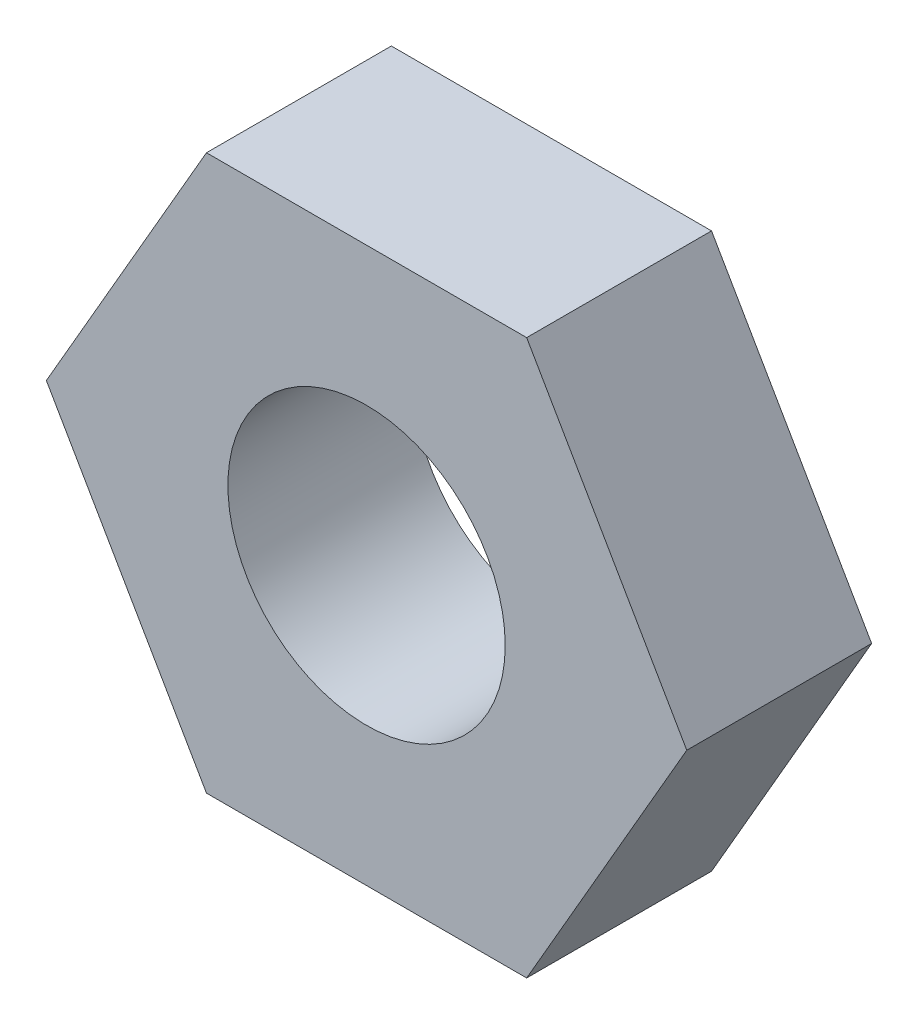
ISO-10303-21;
HEADER;
FILE_DESCRIPTION(('STEP AP214'),'2;1');
FILE_NAME('part.step','',(''),(''),'','','');
FILE_SCHEMA(('AUTOMOTIVE_DESIGN { 1 0 10303 214 1 1 1 1 }'));
ENDSEC;
DATA;
#1=APPLICATION_CONTEXT('core data for automotive mechanical design processes');
#2=APPLICATION_PROTOCOL_DEFINITION('international standard','automotive_design',2000,#1);
#3=PRODUCT_CONTEXT('',#1,'mechanical');
#4=PRODUCT('Part','Part','',(#3));
#5=PRODUCT_RELATED_PRODUCT_CATEGORY('part','',(#4));
#6=PRODUCT_DEFINITION_FORMATION('','',#4);
#7=PRODUCT_DEFINITION_CONTEXT('part definition',#1,'design');
#8=PRODUCT_DEFINITION('design','',#6,#7);
#9=PRODUCT_DEFINITION_SHAPE('','',#8);
#10=(LENGTH_UNIT() NAMED_UNIT(*) SI_UNIT(.MILLI.,.METRE.));
#11=(NAMED_UNIT(*) PLANE_ANGLE_UNIT() SI_UNIT($,.RADIAN.));
#12=(NAMED_UNIT(*) SI_UNIT($,.STERADIAN.) SOLID_ANGLE_UNIT());
#13=UNCERTAINTY_MEASURE_WITH_UNIT(LENGTH_MEASURE(1.E-05),#10,'distance_accuracy_value','');
#14=(GEOMETRIC_REPRESENTATION_CONTEXT(3) GLOBAL_UNCERTAINTY_ASSIGNED_CONTEXT((#13)) GLOBAL_UNIT_ASSIGNED_CONTEXT((#10,
#11,#12)) REPRESENTATION_CONTEXT('',''));
#15=CARTESIAN_POINT('',(0.,0.,0.));
#16=DIRECTION('',(0.,0.,1.));
#17=DIRECTION('',(1.,0.,0.));
#18=AXIS2_PLACEMENT_3D('',#15,#16,#17);
#19=CARTESIAN_POINT('',(0.,0.,2.));
#20=DIRECTION('',(0.,0.,1.));
#21=DIRECTION('',(1.,0.,0.));
#22=AXIS2_PLACEMENT_3D('',#19,#20,#21);
#23=PLANE('',#22);
#24=DIRECTION('',(0.499999999999995,0.866025403784441,0.));
#25=VECTOR('',#24,1.);
#26=CARTESIAN_POINT('',(1.73205080756891,-2.99999999999998,2.));
#27=LINE('',#26,#25);
#28=CARTESIAN_POINT('',(1.73205080756891,-2.99999999999998,2.));
#29=VERTEX_POINT('',#28);
#30=CARTESIAN_POINT('',(3.46410161513776,0.,2.));
#31=VERTEX_POINT('',#30);
#32=EDGE_CURVE('E152',#29,#31,#27,.T.);
#33=ORIENTED_EDGE('',*,*,#32,.T.);
#34=DIRECTION('',(-0.500000000000001,0.866025403784438,0.));
#35=VECTOR('',#34,1.);
#36=CARTESIAN_POINT('',(3.46410161513776,0.,2.));
#37=LINE('',#36,#35);
#38=CARTESIAN_POINT('',(1.73205080756887,3.00000000000001,2.));
#39=VERTEX_POINT('',#38);
#40=EDGE_CURVE('E100',#31,#39,#37,.T.);
#41=ORIENTED_EDGE('',*,*,#40,.T.);
#42=DIRECTION('',(-1.,0.,0.));
#43=VECTOR('',#42,1.);
#44=CARTESIAN_POINT('',(1.73205080756887,3.00000000000001,2.));
#45=LINE('',#44,#43);
#46=CARTESIAN_POINT('',(-1.73205080756889,2.99999999999999,2.));
#47=VERTEX_POINT('',#46);
#48=EDGE_CURVE('E113',#39,#47,#45,.T.);
#49=ORIENTED_EDGE('',*,*,#48,.T.);
#50=DIRECTION('',(-0.499999999999995,-0.866025403784442,0.));
#51=VECTOR('',#50,1.);
#52=CARTESIAN_POINT('',(-1.73205080756889,2.99999999999999,2.));
#53=LINE('',#52,#51);
#54=CARTESIAN_POINT('',(-3.46410161513776,0.,2.));
#55=VERTEX_POINT('',#54);
#56=EDGE_CURVE('E107',#47,#55,#53,.T.);
#57=ORIENTED_EDGE('',*,*,#56,.T.);
#58=DIRECTION('',(0.500000000000007,-0.866025403784435,0.));
#59=VECTOR('',#58,1.);
#60=CARTESIAN_POINT('',(-3.46410161513776,0.,2.));
#61=LINE('',#60,#59);
#62=CARTESIAN_POINT('',(-1.73205080756885,-3.00000000000002,2.));
#63=VERTEX_POINT('',#62);
#64=EDGE_CURVE('E111',#55,#63,#61,.T.);
#65=ORIENTED_EDGE('',*,*,#64,.T.);
#66=DIRECTION('',(1.,0.,0.));
#67=VECTOR('',#66,1.);
#68=CARTESIAN_POINT('',(-1.73205080756885,-3.00000000000002,2.));
#69=LINE('',#68,#67);
#70=EDGE_CURVE('E63',#63,#29,#69,.T.);
#71=ORIENTED_EDGE('',*,*,#70,.T.);
#72=EDGE_LOOP('',(#33,#41,#49,#57,#65,#71));
#73=FACE_BOUND('',#72,.T.);
#74=CARTESIAN_POINT('',(0.,0.,2.));
#75=DIRECTION('',(0.,0.,1.));
#76=DIRECTION('',(1.,0.,0.));
#77=AXIS2_PLACEMENT_3D('',#74,#75,#76);
#78=CIRCLE('',#77,1.5);
#79=CARTESIAN_POINT('',(1.5,0.,2.));
#80=VERTEX_POINT('',#79);
#81=EDGE_CURVE('E140',#80,#80,#78,.T.);
#82=ORIENTED_EDGE('',*,*,#81,.F.);
#83=EDGE_LOOP('',(#82));
#84=FACE_BOUND('',#83,.T.);
#85=ADVANCED_FACE('F45',(#73,#84),#23,.T.);
#86=CARTESIAN_POINT('',(0.,0.,0.));
#87=DIRECTION('',(0.,0.,1.));
#88=DIRECTION('',(1.,0.,0.));
#89=AXIS2_PLACEMENT_3D('',#86,#87,#88);
#90=PLANE('',#89);
#91=DIRECTION('',(0.499999999999995,0.866025403784441,0.));
#92=VECTOR('',#91,1.);
#93=CARTESIAN_POINT('',(1.73205080756891,-2.99999999999998,0.));
#94=LINE('',#93,#92);
#95=CARTESIAN_POINT('',(1.73205080756891,-2.99999999999998,0.));
#96=VERTEX_POINT('',#95);
#97=CARTESIAN_POINT('',(3.46410161513776,0.,0.));
#98=VERTEX_POINT('',#97);
#99=EDGE_CURVE('E135',#96,#98,#94,.T.);
#100=ORIENTED_EDGE('',*,*,#99,.F.);
#101=DIRECTION('',(1.,0.,0.));
#102=VECTOR('',#101,1.);
#103=CARTESIAN_POINT('',(-1.73205080756885,-3.00000000000002,0.));
#104=LINE('',#103,#102);
#105=CARTESIAN_POINT('',(-1.73205080756885,-3.00000000000002,0.));
#106=VERTEX_POINT('',#105);
#107=EDGE_CURVE('E92',#106,#96,#104,.T.);
#108=ORIENTED_EDGE('',*,*,#107,.F.);
#109=DIRECTION('',(0.500000000000007,-0.866025403784435,0.));
#110=VECTOR('',#109,1.);
#111=CARTESIAN_POINT('',(-3.46410161513776,0.,0.));
#112=LINE('',#111,#110);
#113=CARTESIAN_POINT('',(-3.46410161513776,0.,0.));
#114=VERTEX_POINT('',#113);
#115=EDGE_CURVE('E86',#114,#106,#112,.T.);
#116=ORIENTED_EDGE('',*,*,#115,.F.);
#117=DIRECTION('',(-0.499999999999995,-0.866025403784442,0.));
#118=VECTOR('',#117,1.);
#119=CARTESIAN_POINT('',(-1.73205080756889,2.99999999999999,0.));
#120=LINE('',#119,#118);
#121=CARTESIAN_POINT('',(-1.73205080756889,2.99999999999999,0.));
#122=VERTEX_POINT('',#121);
#123=EDGE_CURVE('E122',#122,#114,#120,.T.);
#124=ORIENTED_EDGE('',*,*,#123,.F.);
#125=DIRECTION('',(-1.,0.,0.));
#126=VECTOR('',#125,1.);
#127=CARTESIAN_POINT('',(1.73205080756887,3.00000000000001,0.));
#128=LINE('',#127,#126);
#129=CARTESIAN_POINT('',(1.73205080756887,3.00000000000001,0.));
#130=VERTEX_POINT('',#129);
#131=EDGE_CURVE('E143',#130,#122,#128,.T.);
#132=ORIENTED_EDGE('',*,*,#131,.F.);
#133=DIRECTION('',(-0.500000000000001,0.866025403784438,0.));
#134=VECTOR('',#133,1.);
#135=CARTESIAN_POINT('',(3.46410161513776,0.,0.));
#136=LINE('',#135,#134);
#137=EDGE_CURVE('E139',#98,#130,#136,.T.);
#138=ORIENTED_EDGE('',*,*,#137,.F.);
#139=EDGE_LOOP('',(#100,#108,#116,#124,#132,#138));
#140=FACE_BOUND('',#139,.T.);
#141=CARTESIAN_POINT('',(0.,0.,0.));
#142=DIRECTION('',(0.,0.,1.));
#143=DIRECTION('',(1.,0.,0.));
#144=AXIS2_PLACEMENT_3D('',#141,#142,#143);
#145=CIRCLE('',#144,1.5);
#146=CARTESIAN_POINT('',(1.5,0.,0.));
#147=VERTEX_POINT('',#146);
#148=EDGE_CURVE('E249',#147,#147,#145,.T.);
#149=ORIENTED_EDGE('',*,*,#148,.T.);
#150=EDGE_LOOP('',(#149));
#151=FACE_BOUND('',#150,.T.);
#152=ADVANCED_FACE('F165',(#140,#151),#90,.F.);
#153=CARTESIAN_POINT('',(1.73205080756891,-2.99999999999998,2.));
#154=DIRECTION('',(-0.866025403784441,0.499999999999995,0.));
#155=DIRECTION('',(-0.499999999999995,-0.866025403784441,0.));
#156=AXIS2_PLACEMENT_3D('',#153,#154,#155);
#157=PLANE('',#156);
#158=ORIENTED_EDGE('',*,*,#99,.T.);
#159=DIRECTION('',(0.,0.,-1.));
#160=VECTOR('',#159,1.);
#161=CARTESIAN_POINT('',(3.46410161513776,0.,2.));
#162=LINE('',#161,#160);
#163=EDGE_CURVE('E11',#31,#98,#162,.T.);
#164=ORIENTED_EDGE('',*,*,#163,.F.);
#165=ORIENTED_EDGE('',*,*,#32,.F.);
#166=DIRECTION('',(0.,0.,-1.));
#167=VECTOR('',#166,1.);
#168=CARTESIAN_POINT('',(1.73205080756891,-2.99999999999998,2.));
#169=LINE('',#168,#167);
#170=EDGE_CURVE('E131',#29,#96,#169,.T.);
#171=ORIENTED_EDGE('',*,*,#170,.T.);
#172=EDGE_LOOP('',(#158,#164,#165,#171));
#173=FACE_BOUND('',#172,.T.);
#174=ADVANCED_FACE('F47',(#173),#157,.F.);
#175=CARTESIAN_POINT('',(3.46410161513776,0.,2.));
#176=DIRECTION('',(-0.866025403784438,-0.500000000000001,0.));
#177=DIRECTION('',(0.500000000000001,-0.866025403784438,0.));
#178=AXIS2_PLACEMENT_3D('',#175,#176,#177);
#179=PLANE('',#178);
#180=ORIENTED_EDGE('',*,*,#137,.T.);
#181=DIRECTION('',(0.,0.,-1.));
#182=VECTOR('',#181,1.);
#183=CARTESIAN_POINT('',(1.73205080756887,3.00000000000001,2.));
#184=LINE('',#183,#182);
#185=EDGE_CURVE('E55',#39,#130,#184,.T.);
#186=ORIENTED_EDGE('',*,*,#185,.F.);
#187=ORIENTED_EDGE('',*,*,#40,.F.);
#188=ORIENTED_EDGE('',*,*,#163,.T.);
#189=EDGE_LOOP('',(#180,#186,#187,#188));
#190=FACE_BOUND('',#189,.T.);
#191=ADVANCED_FACE('F190',(#190),#179,.F.);
#192=CARTESIAN_POINT('',(1.73205080756887,3.00000000000001,2.));
#193=DIRECTION('',(0.,-1.,0.));
#194=DIRECTION('',(1.,0.,0.));
#195=AXIS2_PLACEMENT_3D('',#192,#193,#194);
#196=PLANE('',#195);
#197=ORIENTED_EDGE('',*,*,#131,.T.);
#198=DIRECTION('',(0.,0.,-1.));
#199=VECTOR('',#198,1.);
#200=CARTESIAN_POINT('',(-1.73205080756889,2.99999999999999,2.));
#201=LINE('',#200,#199);
#202=EDGE_CURVE('E124',#47,#122,#201,.T.);
#203=ORIENTED_EDGE('',*,*,#202,.F.);
#204=ORIENTED_EDGE('',*,*,#48,.F.);
#205=ORIENTED_EDGE('',*,*,#185,.T.);
#206=EDGE_LOOP('',(#197,#203,#204,#205));
#207=FACE_BOUND('',#206,.T.);
#208=ADVANCED_FACE('F162',(#207),#196,.F.);
#209=CARTESIAN_POINT('',(-1.73205080756889,2.99999999999999,2.));
#210=DIRECTION('',(0.866025403784442,-0.499999999999995,0.));
#211=DIRECTION('',(0.499999999999995,0.866025403784442,0.));
#212=AXIS2_PLACEMENT_3D('',#209,#210,#211);
#213=PLANE('',#212);
#214=ORIENTED_EDGE('',*,*,#123,.T.);
#215=DIRECTION('',(0.,0.,-1.));
#216=VECTOR('',#215,1.);
#217=CARTESIAN_POINT('',(-3.46410161513776,0.,2.));
#218=LINE('',#217,#216);
#219=EDGE_CURVE('E119',#55,#114,#218,.T.);
#220=ORIENTED_EDGE('',*,*,#219,.F.);
#221=ORIENTED_EDGE('',*,*,#56,.F.);
#222=ORIENTED_EDGE('',*,*,#202,.T.);
#223=EDGE_LOOP('',(#214,#220,#221,#222));
#224=FACE_BOUND('',#223,.T.);
#225=ADVANCED_FACE('F120',(#224),#213,.F.);
#226=CARTESIAN_POINT('',(-3.46410161513776,0.,2.));
#227=DIRECTION('',(0.866025403784435,0.500000000000007,0.));
#228=DIRECTION('',(-0.500000000000007,0.866025403784434,0.));
#229=AXIS2_PLACEMENT_3D('',#226,#227,#228);
#230=PLANE('',#229);
#231=ORIENTED_EDGE('',*,*,#115,.T.);
#232=DIRECTION('',(0.,0.,-1.));
#233=VECTOR('',#232,1.);
#234=CARTESIAN_POINT('',(-1.73205080756885,-3.00000000000002,2.));
#235=LINE('',#234,#233);
#236=EDGE_CURVE('E125',#63,#106,#235,.T.);
#237=ORIENTED_EDGE('',*,*,#236,.F.);
#238=ORIENTED_EDGE('',*,*,#64,.F.);
#239=ORIENTED_EDGE('',*,*,#219,.T.);
#240=EDGE_LOOP('',(#231,#237,#238,#239));
#241=FACE_BOUND('',#240,.T.);
#242=ADVANCED_FACE('F127',(#241),#230,.F.);
#243=CARTESIAN_POINT('',(-1.73205080756885,-3.00000000000002,2.));
#244=DIRECTION('',(0.,1.,0.));
#245=DIRECTION('',(-1.,0.,0.));
#246=AXIS2_PLACEMENT_3D('',#243,#244,#245);
#247=PLANE('',#246);
#248=ORIENTED_EDGE('',*,*,#107,.T.);
#249=ORIENTED_EDGE('',*,*,#170,.F.);
#250=ORIENTED_EDGE('',*,*,#70,.F.);
#251=ORIENTED_EDGE('',*,*,#236,.T.);
#252=EDGE_LOOP('',(#248,#249,#250,#251));
#253=FACE_BOUND('',#252,.T.);
#254=ADVANCED_FACE('F170',(#253),#247,.F.);
#255=CARTESIAN_POINT('',(0.,0.,2.));
#256=DIRECTION('',(0.,0.,-1.));
#257=DIRECTION('',(-1.,0.,0.));
#258=AXIS2_PLACEMENT_3D('',#255,#256,#257);
#259=CYLINDRICAL_SURFACE('',#258,1.5);
#260=ORIENTED_EDGE('',*,*,#81,.T.);
#261=EDGE_LOOP('',(#260));
#262=FACE_BOUND('',#261,.T.);
#263=ORIENTED_EDGE('',*,*,#148,.F.);
#264=EDGE_LOOP('',(#263));
#265=FACE_BOUND('',#264,.T.);
#266=ADVANCED_FACE('F172',(#262,#265),#259,.F.);
#267=CLOSED_SHELL('',(#85,#152,#174,#191,#208,#225,#242,#254,#266));
#268=MANIFOLD_SOLID_BREP('B2',#267);
#269=ADVANCED_BREP_SHAPE_REPRESENTATION('',(#18,#268),#14);
#270=SHAPE_DEFINITION_REPRESENTATION(#9,#269);
ENDSEC;
END-ISO-10303-21;
